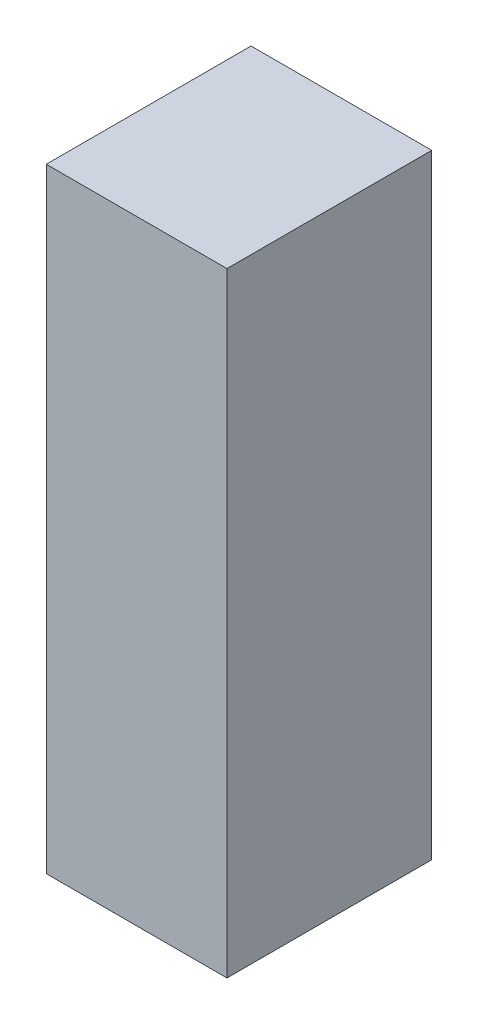
ISO-10303-21;
HEADER;
FILE_DESCRIPTION(('STEP AP214'),'2;1');
FILE_NAME('part.step','',(''),(''),'','','');
FILE_SCHEMA(('AUTOMOTIVE_DESIGN { 1 0 10303 214 1 1 1 1 }'));
ENDSEC;
DATA;
#1=APPLICATION_CONTEXT('core data for automotive mechanical design processes');
#2=APPLICATION_PROTOCOL_DEFINITION('international standard','automotive_design',2000,#1);
#3=PRODUCT_CONTEXT('',#1,'mechanical');
#4=PRODUCT('Part','Part','',(#3));
#5=PRODUCT_RELATED_PRODUCT_CATEGORY('part','',(#4));
#6=PRODUCT_DEFINITION_FORMATION('','',#4);
#7=PRODUCT_DEFINITION_CONTEXT('part definition',#1,'design');
#8=PRODUCT_DEFINITION('design','',#6,#7);
#9=PRODUCT_DEFINITION_SHAPE('','',#8);
#10=(LENGTH_UNIT() NAMED_UNIT(*) SI_UNIT(.MILLI.,.METRE.));
#11=(NAMED_UNIT(*) PLANE_ANGLE_UNIT() SI_UNIT($,.RADIAN.));
#12=(NAMED_UNIT(*) SI_UNIT($,.STERADIAN.) SOLID_ANGLE_UNIT());
#13=UNCERTAINTY_MEASURE_WITH_UNIT(LENGTH_MEASURE(1.E-05),#10,'distance_accuracy_value','');
#14=(GEOMETRIC_REPRESENTATION_CONTEXT(3) GLOBAL_UNCERTAINTY_ASSIGNED_CONTEXT((#13)) GLOBAL_UNIT_ASSIGNED_CONTEXT((#10,
#11,#12)) REPRESENTATION_CONTEXT('',''));
#15=CARTESIAN_POINT('',(0.,0.,0.));
#16=DIRECTION('',(0.,0.,1.));
#17=DIRECTION('',(1.,0.,0.));
#18=AXIS2_PLACEMENT_3D('',#15,#16,#17);
#19=CARTESIAN_POINT('',(-46.8919335054172,102.,-10.7940943403225));
#20=DIRECTION('',(1.,0.,0.));
#21=DIRECTION('',(0.,0.,-1.));
#22=AXIS2_PLACEMENT_3D('',#19,#20,#21);
#23=PLANE('',#22);
#24=DIRECTION('',(0.,0.,1.));
#25=VECTOR('',#24,1.);
#26=CARTESIAN_POINT('',(-46.8919335054172,0.,-10.7940943403225));
#27=LINE('',#26,#25);
#28=CARTESIAN_POINT('',(-46.8919335054172,0.,-10.7940943403225));
#29=VERTEX_POINT('',#28);
#30=CARTESIAN_POINT('',(-46.8919335054172,0.,23.2059056596775));
#31=VERTEX_POINT('',#30);
#32=EDGE_CURVE('E115',#29,#31,#27,.T.);
#33=ORIENTED_EDGE('',*,*,#32,.T.);
#34=DIRECTION('',(0.,-1.,0.));
#35=VECTOR('',#34,1.);
#36=CARTESIAN_POINT('',(-46.8919335054172,102.,23.2059056596775));
#37=LINE('',#36,#35);
#38=CARTESIAN_POINT('',(-46.8919335054172,102.,23.2059056596775));
#39=VERTEX_POINT('',#38);
#40=EDGE_CURVE('E11',#39,#31,#37,.T.);
#41=ORIENTED_EDGE('',*,*,#40,.F.);
#42=DIRECTION('',(0.,0.,1.));
#43=VECTOR('',#42,1.);
#44=CARTESIAN_POINT('',(-46.8919335054172,102.,-10.7940943403225));
#45=LINE('',#44,#43);
#46=CARTESIAN_POINT('',(-46.8919335054172,102.,-10.7940943403225));
#47=VERTEX_POINT('',#46);
#48=EDGE_CURVE('E99',#47,#39,#45,.T.);
#49=ORIENTED_EDGE('',*,*,#48,.F.);
#50=DIRECTION('',(0.,-1.,0.));
#51=VECTOR('',#50,1.);
#52=CARTESIAN_POINT('',(-46.8919335054172,102.,-10.7940943403225));
#53=LINE('',#52,#51);
#54=EDGE_CURVE('E111',#47,#29,#53,.T.);
#55=ORIENTED_EDGE('',*,*,#54,.T.);
#56=EDGE_LOOP('',(#33,#41,#49,#55));
#57=FACE_BOUND('',#56,.T.);
#58=ADVANCED_FACE('F44',(#57),#23,.F.);
#59=CARTESIAN_POINT('',(-46.8919335054172,102.,23.2059056596775));
#60=DIRECTION('',(0.,0.,-1.));
#61=DIRECTION('',(-1.,0.,0.));
#62=AXIS2_PLACEMENT_3D('',#59,#60,#61);
#63=PLANE('',#62);
#64=DIRECTION('',(1.,0.,0.));
#65=VECTOR('',#64,1.);
#66=CARTESIAN_POINT('',(-46.8919335054172,0.,23.2059056596775));
#67=LINE('',#66,#65);
#68=CARTESIAN_POINT('',(-16.8919335054172,0.,23.2059056596775));
#69=VERTEX_POINT('',#68);
#70=EDGE_CURVE('E103',#31,#69,#67,.T.);
#71=ORIENTED_EDGE('',*,*,#70,.T.);
#72=DIRECTION('',(0.,-1.,0.));
#73=VECTOR('',#72,1.);
#74=CARTESIAN_POINT('',(-16.8919335054172,102.,23.2059056596775));
#75=LINE('',#74,#73);
#76=CARTESIAN_POINT('',(-16.8919335054172,102.,23.2059056596775));
#77=VERTEX_POINT('',#76);
#78=EDGE_CURVE('E53',#77,#69,#75,.T.);
#79=ORIENTED_EDGE('',*,*,#78,.F.);
#80=DIRECTION('',(1.,0.,0.));
#81=VECTOR('',#80,1.);
#82=CARTESIAN_POINT('',(-46.8919335054172,102.,23.2059056596775));
#83=LINE('',#82,#81);
#84=EDGE_CURVE('E94',#39,#77,#83,.T.);
#85=ORIENTED_EDGE('',*,*,#84,.F.);
#86=ORIENTED_EDGE('',*,*,#40,.T.);
#87=EDGE_LOOP('',(#71,#79,#85,#86));
#88=FACE_BOUND('',#87,.T.);
#89=ADVANCED_FACE('F102',(#88),#63,.F.);
#90=CARTESIAN_POINT('',(-16.8919335054172,102.,-10.7940943403225));
#91=DIRECTION('',(-1.,0.,0.));
#92=DIRECTION('',(0.,0.,1.));
#93=AXIS2_PLACEMENT_3D('',#90,#91,#92);
#94=PLANE('',#93);
#95=DIRECTION('',(0.,0.,-1.));
#96=VECTOR('',#95,1.);
#97=CARTESIAN_POINT('',(-16.8919335054172,0.,-10.7940943403225));
#98=LINE('',#97,#96);
#99=CARTESIAN_POINT('',(-16.8919335054172,0.,-10.7940943403225));
#100=VERTEX_POINT('',#99);
#101=EDGE_CURVE('E81',#69,#100,#98,.T.);
#102=ORIENTED_EDGE('',*,*,#101,.T.);
#103=DIRECTION('',(0.,-1.,0.));
#104=VECTOR('',#103,1.);
#105=CARTESIAN_POINT('',(-16.8919335054172,102.,-10.7940943403225));
#106=LINE('',#105,#104);
#107=CARTESIAN_POINT('',(-16.8919335054172,102.,-10.7940943403225));
#108=VERTEX_POINT('',#107);
#109=EDGE_CURVE('E105',#108,#100,#106,.T.);
#110=ORIENTED_EDGE('',*,*,#109,.F.);
#111=DIRECTION('',(0.,0.,-1.));
#112=VECTOR('',#111,1.);
#113=CARTESIAN_POINT('',(-16.8919335054172,102.,-10.7940943403225));
#114=LINE('',#113,#112);
#115=EDGE_CURVE('E97',#77,#108,#114,.T.);
#116=ORIENTED_EDGE('',*,*,#115,.F.);
#117=ORIENTED_EDGE('',*,*,#78,.T.);
#118=EDGE_LOOP('',(#102,#110,#116,#117));
#119=FACE_BOUND('',#118,.T.);
#120=ADVANCED_FACE('F106',(#119),#94,.F.);
#121=CARTESIAN_POINT('',(-46.8919335054172,102.,-10.7940943403225));
#122=DIRECTION('',(0.,0.,1.));
#123=DIRECTION('',(1.,0.,0.));
#124=AXIS2_PLACEMENT_3D('',#121,#122,#123);
#125=PLANE('',#124);
#126=DIRECTION('',(-1.,0.,0.));
#127=VECTOR('',#126,1.);
#128=CARTESIAN_POINT('',(-46.8919335054172,0.,-10.7940943403225));
#129=LINE('',#128,#127);
#130=EDGE_CURVE('E87',#100,#29,#129,.T.);
#131=ORIENTED_EDGE('',*,*,#130,.T.);
#132=ORIENTED_EDGE('',*,*,#54,.F.);
#133=DIRECTION('',(-1.,0.,0.));
#134=VECTOR('',#133,1.);
#135=CARTESIAN_POINT('',(-46.8919335054172,102.,-10.7940943403225));
#136=LINE('',#135,#134);
#137=EDGE_CURVE('E64',#108,#47,#136,.T.);
#138=ORIENTED_EDGE('',*,*,#137,.F.);
#139=ORIENTED_EDGE('',*,*,#109,.T.);
#140=EDGE_LOOP('',(#131,#132,#138,#139));
#141=FACE_BOUND('',#140,.T.);
#142=ADVANCED_FACE('F125',(#141),#125,.F.);
#143=CARTESIAN_POINT('',(0.,102.,0.));
#144=DIRECTION('',(0.,1.,0.));
#145=DIRECTION('',(0.,0.,1.));
#146=AXIS2_PLACEMENT_3D('',#143,#144,#145);
#147=PLANE('',#146);
#148=ORIENTED_EDGE('',*,*,#48,.T.);
#149=ORIENTED_EDGE('',*,*,#84,.T.);
#150=ORIENTED_EDGE('',*,*,#115,.T.);
#151=ORIENTED_EDGE('',*,*,#137,.T.);
#152=EDGE_LOOP('',(#148,#149,#150,#151));
#153=FACE_BOUND('',#152,.T.);
#154=ADVANCED_FACE('F95',(#153),#147,.T.);
#155=CARTESIAN_POINT('',(0.,0.,0.));
#156=DIRECTION('',(0.,1.,0.));
#157=DIRECTION('',(0.,0.,1.));
#158=AXIS2_PLACEMENT_3D('',#155,#156,#157);
#159=PLANE('',#158);
#160=ORIENTED_EDGE('',*,*,#32,.F.);
#161=ORIENTED_EDGE('',*,*,#130,.F.);
#162=ORIENTED_EDGE('',*,*,#101,.F.);
#163=ORIENTED_EDGE('',*,*,#70,.F.);
#164=EDGE_LOOP('',(#160,#161,#162,#163));
#165=FACE_BOUND('',#164,.T.);
#166=ADVANCED_FACE('F128',(#165),#159,.F.);
#167=CLOSED_SHELL('',(#58,#89,#120,#142,#154,#166));
#168=MANIFOLD_SOLID_BREP('B2',#167);
#169=ADVANCED_BREP_SHAPE_REPRESENTATION('',(#18,#168),#14);
#170=SHAPE_DEFINITION_REPRESENTATION(#9,#169);
ENDSEC;
END-ISO-10303-21;
